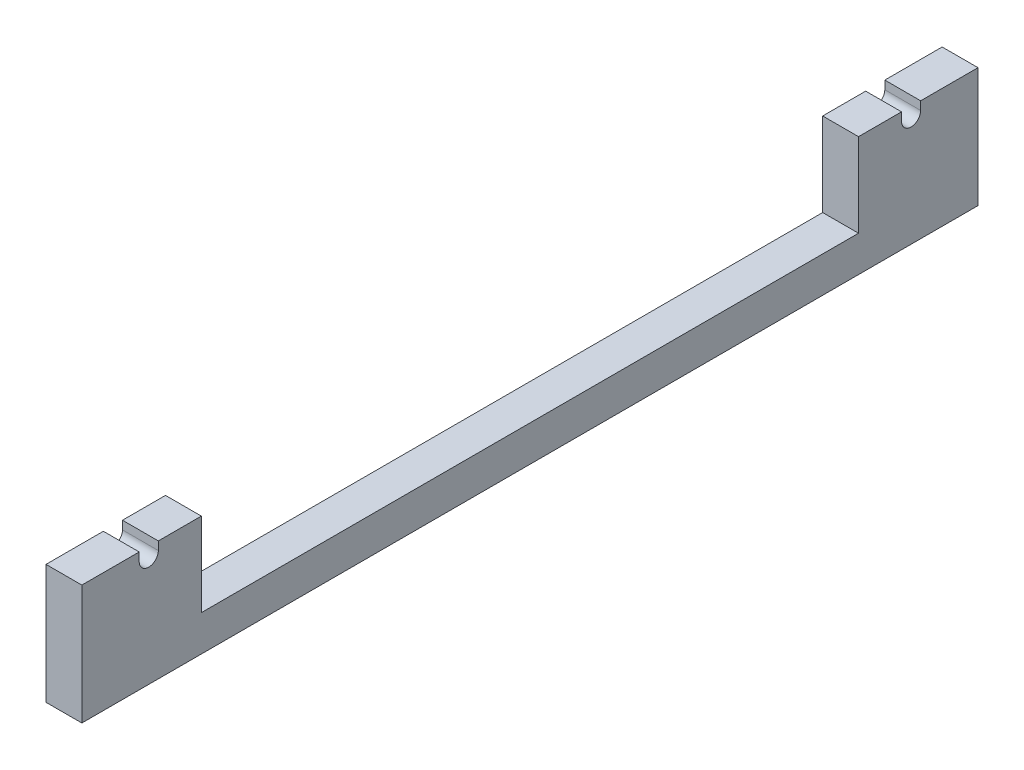
ISO-10303-21;
HEADER;
FILE_DESCRIPTION(('STEP AP214'),'2;1');
FILE_NAME('part.step','',(''),(''),'','','');
FILE_SCHEMA(('AUTOMOTIVE_DESIGN { 1 0 10303 214 1 1 1 1 }'));
ENDSEC;
DATA;
#1=APPLICATION_CONTEXT('core data for automotive mechanical design processes');
#2=APPLICATION_PROTOCOL_DEFINITION('international standard','automotive_design',2000,#1);
#3=PRODUCT_CONTEXT('',#1,'mechanical');
#4=PRODUCT('Part','Part','',(#3));
#5=PRODUCT_RELATED_PRODUCT_CATEGORY('part','',(#4));
#6=PRODUCT_DEFINITION_FORMATION('','',#4);
#7=PRODUCT_DEFINITION_CONTEXT('part definition',#1,'design');
#8=PRODUCT_DEFINITION('design','',#6,#7);
#9=PRODUCT_DEFINITION_SHAPE('','',#8);
#10=(LENGTH_UNIT() NAMED_UNIT(*) SI_UNIT(.MILLI.,.METRE.));
#11=(NAMED_UNIT(*) PLANE_ANGLE_UNIT() SI_UNIT($,.RADIAN.));
#12=(NAMED_UNIT(*) SI_UNIT($,.STERADIAN.) SOLID_ANGLE_UNIT());
#13=UNCERTAINTY_MEASURE_WITH_UNIT(LENGTH_MEASURE(1.E-05),#10,'distance_accuracy_value','');
#14=(GEOMETRIC_REPRESENTATION_CONTEXT(3) GLOBAL_UNCERTAINTY_ASSIGNED_CONTEXT((#13)) GLOBAL_UNIT_ASSIGNED_CONTEXT((#10,
#11,#12)) REPRESENTATION_CONTEXT('',''));
#15=CARTESIAN_POINT('',(0.,0.,0.));
#16=DIRECTION('',(0.,0.,1.));
#17=DIRECTION('',(1.,0.,0.));
#18=AXIS2_PLACEMENT_3D('',#15,#16,#17);
#19=CARTESIAN_POINT('',(15.,50.,0.));
#20=DIRECTION('',(0.,0.,-1.));
#21=DIRECTION('',(0.,1.,0.));
#22=AXIS2_PLACEMENT_3D('',#19,#20,#21);
#23=PLANE('',#22);
#24=DIRECTION('',(0.,-1.,0.));
#25=VECTOR('',#24,1.);
#26=CARTESIAN_POINT('',(0.,50.,0.));
#27=LINE('',#26,#25);
#28=CARTESIAN_POINT('',(0.,50.,0.));
#29=VERTEX_POINT('',#28);
#30=CARTESIAN_POINT('',(0.,0.,0.));
#31=VERTEX_POINT('',#30);
#32=EDGE_CURVE('E177',#29,#31,#27,.T.);
#33=ORIENTED_EDGE('',*,*,#32,.T.);
#34=DIRECTION('',(-1.,0.,0.));
#35=VECTOR('',#34,1.);
#36=CARTESIAN_POINT('',(15.,0.,0.));
#37=LINE('',#36,#35);
#38=CARTESIAN_POINT('',(15.,0.,0.));
#39=VERTEX_POINT('',#38);
#40=EDGE_CURVE('E11',#39,#31,#37,.T.);
#41=ORIENTED_EDGE('',*,*,#40,.F.);
#42=DIRECTION('',(0.,-1.,0.));
#43=VECTOR('',#42,1.);
#44=CARTESIAN_POINT('',(15.,50.,0.));
#45=LINE('',#44,#43);
#46=CARTESIAN_POINT('',(15.,50.,0.));
#47=VERTEX_POINT('',#46);
#48=EDGE_CURVE('E207',#47,#39,#45,.T.);
#49=ORIENTED_EDGE('',*,*,#48,.F.);
#50=DIRECTION('',(-1.,0.,0.));
#51=VECTOR('',#50,1.);
#52=CARTESIAN_POINT('',(15.,50.,0.));
#53=LINE('',#52,#51);
#54=EDGE_CURVE('E173',#47,#29,#53,.T.);
#55=ORIENTED_EDGE('',*,*,#54,.T.);
#56=EDGE_LOOP('',(#33,#41,#49,#55));
#57=FACE_BOUND('',#56,.T.);
#58=ADVANCED_FACE('F33',(#57),#23,.F.);
#59=CARTESIAN_POINT('',(15.,0.,0.));
#60=DIRECTION('',(0.,1.,0.));
#61=DIRECTION('',(0.,0.,1.));
#62=AXIS2_PLACEMENT_3D('',#59,#60,#61);
#63=PLANE('',#62);
#64=DIRECTION('',(0.,0.,-1.));
#65=VECTOR('',#64,1.);
#66=CARTESIAN_POINT('',(0.,0.,0.));
#67=LINE('',#66,#65);
#68=CARTESIAN_POINT('',(0.,0.,-375.));
#69=VERTEX_POINT('',#68);
#70=EDGE_CURVE('E180',#31,#69,#67,.T.);
#71=ORIENTED_EDGE('',*,*,#70,.T.);
#72=DIRECTION('',(-1.,0.,0.));
#73=VECTOR('',#72,1.);
#74=CARTESIAN_POINT('',(15.,0.,-375.));
#75=LINE('',#74,#73);
#76=CARTESIAN_POINT('',(15.,0.,-375.));
#77=VERTEX_POINT('',#76);
#78=EDGE_CURVE('E41',#77,#69,#75,.T.);
#79=ORIENTED_EDGE('',*,*,#78,.F.);
#80=DIRECTION('',(0.,0.,-1.));
#81=VECTOR('',#80,1.);
#82=CARTESIAN_POINT('',(15.,0.,0.));
#83=LINE('',#82,#81);
#84=EDGE_CURVE('E116',#39,#77,#83,.T.);
#85=ORIENTED_EDGE('',*,*,#84,.F.);
#86=ORIENTED_EDGE('',*,*,#40,.T.);
#87=EDGE_LOOP('',(#71,#79,#85,#86));
#88=FACE_BOUND('',#87,.T.);
#89=ADVANCED_FACE('F305',(#88),#63,.F.);
#90=CARTESIAN_POINT('',(15.,0.,-375.));
#91=DIRECTION('',(0.,0.,1.));
#92=DIRECTION('',(1.,0.,0.));
#93=AXIS2_PLACEMENT_3D('',#90,#91,#92);
#94=PLANE('',#93);
#95=DIRECTION('',(0.,1.,0.));
#96=VECTOR('',#95,1.);
#97=CARTESIAN_POINT('',(0.,0.,-375.));
#98=LINE('',#97,#96);
#99=CARTESIAN_POINT('',(0.,50.,-375.));
#100=VERTEX_POINT('',#99);
#101=EDGE_CURVE('E182',#69,#100,#98,.T.);
#102=ORIENTED_EDGE('',*,*,#101,.T.);
#103=DIRECTION('',(-1.,0.,0.));
#104=VECTOR('',#103,1.);
#105=CARTESIAN_POINT('',(15.,50.,-375.));
#106=LINE('',#105,#104);
#107=CARTESIAN_POINT('',(15.,50.,-375.));
#108=VERTEX_POINT('',#107);
#109=EDGE_CURVE('E238',#108,#100,#106,.T.);
#110=ORIENTED_EDGE('',*,*,#109,.F.);
#111=DIRECTION('',(0.,1.,0.));
#112=VECTOR('',#111,1.);
#113=CARTESIAN_POINT('',(15.,0.,-375.));
#114=LINE('',#113,#112);
#115=EDGE_CURVE('E246',#77,#108,#114,.T.);
#116=ORIENTED_EDGE('',*,*,#115,.F.);
#117=ORIENTED_EDGE('',*,*,#78,.T.);
#118=EDGE_LOOP('',(#102,#110,#116,#117));
#119=FACE_BOUND('',#118,.T.);
#120=ADVANCED_FACE('F244',(#119),#94,.F.);
#121=CARTESIAN_POINT('',(15.,50.,-375.));
#122=DIRECTION('',(0.,-1.,0.));
#123=DIRECTION('',(0.,0.,-1.));
#124=AXIS2_PLACEMENT_3D('',#121,#122,#123);
#125=PLANE('',#124);
#126=DIRECTION('',(0.,0.,1.));
#127=VECTOR('',#126,1.);
#128=CARTESIAN_POINT('',(0.,50.,-375.));
#129=LINE('',#128,#127);
#130=CARTESIAN_POINT('',(0.,50.,-351.));
#131=VERTEX_POINT('',#130);
#132=EDGE_CURVE('E184',#100,#131,#129,.T.);
#133=ORIENTED_EDGE('',*,*,#132,.T.);
#134=DIRECTION('',(-1.,0.,0.));
#135=VECTOR('',#134,1.);
#136=CARTESIAN_POINT('',(15.,50.,-351.));
#137=LINE('',#136,#135);
#138=CARTESIAN_POINT('',(15.,50.,-351.));
#139=VERTEX_POINT('',#138);
#140=EDGE_CURVE('E235',#139,#131,#137,.T.);
#141=ORIENTED_EDGE('',*,*,#140,.F.);
#142=DIRECTION('',(0.,0.,1.));
#143=VECTOR('',#142,1.);
#144=CARTESIAN_POINT('',(15.,50.,-375.));
#145=LINE('',#144,#143);
#146=EDGE_CURVE('E264',#108,#139,#145,.T.);
#147=ORIENTED_EDGE('',*,*,#146,.F.);
#148=ORIENTED_EDGE('',*,*,#109,.T.);
#149=EDGE_LOOP('',(#133,#141,#147,#148));
#150=FACE_BOUND('',#149,.T.);
#151=ADVANCED_FACE('F255',(#150),#125,.F.);
#152=CARTESIAN_POINT('',(15.,46.5,-351.));
#153=DIRECTION('',(0.,0.,-1.));
#154=DIRECTION('',(-1.,0.,0.));
#155=AXIS2_PLACEMENT_3D('',#152,#153,#154);
#156=PLANE('',#155);
#157=DIRECTION('',(0.,-1.,0.));
#158=VECTOR('',#157,1.);
#159=CARTESIAN_POINT('',(0.,46.5,-351.));
#160=LINE('',#159,#158);
#161=CARTESIAN_POINT('',(0.,46.5,-351.));
#162=VERTEX_POINT('',#161);
#163=EDGE_CURVE('E186',#131,#162,#160,.T.);
#164=ORIENTED_EDGE('',*,*,#163,.T.);
#165=DIRECTION('',(-1.,0.,0.));
#166=VECTOR('',#165,1.);
#167=CARTESIAN_POINT('',(15.,46.5,-351.));
#168=LINE('',#167,#166);
#169=CARTESIAN_POINT('',(15.,46.5,-351.));
#170=VERTEX_POINT('',#169);
#171=EDGE_CURVE('E232',#170,#162,#168,.T.);
#172=ORIENTED_EDGE('',*,*,#171,.F.);
#173=DIRECTION('',(0.,-1.,0.));
#174=VECTOR('',#173,1.);
#175=CARTESIAN_POINT('',(15.,46.5,-351.));
#176=LINE('',#175,#174);
#177=EDGE_CURVE('E261',#139,#170,#176,.T.);
#178=ORIENTED_EDGE('',*,*,#177,.F.);
#179=ORIENTED_EDGE('',*,*,#140,.T.);
#180=EDGE_LOOP('',(#164,#172,#178,#179));
#181=FACE_BOUND('',#180,.T.);
#182=ADVANCED_FACE('F259',(#181),#156,.F.);
#183=CARTESIAN_POINT('',(15.,46.5,-347.));
#184=DIRECTION('',(-1.,0.,0.));
#185=DIRECTION('',(0.,0.,1.));
#186=AXIS2_PLACEMENT_3D('',#183,#184,#185);
#187=CYLINDRICAL_SURFACE('',#186,4.);
#188=CARTESIAN_POINT('',(0.,46.5,-347.));
#189=DIRECTION('',(-1.,0.,0.));
#190=DIRECTION('',(0.,0.,-1.));
#191=AXIS2_PLACEMENT_3D('',#188,#189,#190);
#192=CIRCLE('',#191,4.);
#193=CARTESIAN_POINT('',(0.,46.5,-343.));
#194=VERTEX_POINT('',#193);
#195=EDGE_CURVE('E188',#162,#194,#192,.T.);
#196=ORIENTED_EDGE('',*,*,#195,.T.);
#197=DIRECTION('',(-1.,0.,0.));
#198=VECTOR('',#197,1.);
#199=CARTESIAN_POINT('',(15.,46.5,-343.));
#200=LINE('',#199,#198);
#201=CARTESIAN_POINT('',(15.,46.5,-343.));
#202=VERTEX_POINT('',#201);
#203=EDGE_CURVE('E229',#202,#194,#200,.T.);
#204=ORIENTED_EDGE('',*,*,#203,.F.);
#205=CARTESIAN_POINT('',(15.,46.5,-347.));
#206=DIRECTION('',(-1.,0.,0.));
#207=DIRECTION('',(0.,0.,-1.));
#208=AXIS2_PLACEMENT_3D('',#205,#206,#207);
#209=CIRCLE('',#208,4.);
#210=EDGE_CURVE('E263',#170,#202,#209,.T.);
#211=ORIENTED_EDGE('',*,*,#210,.F.);
#212=ORIENTED_EDGE('',*,*,#171,.T.);
#213=EDGE_LOOP('',(#196,#204,#211,#212));
#214=FACE_BOUND('',#213,.T.);
#215=ADVANCED_FACE('F318',(#214),#187,.F.);
#216=CARTESIAN_POINT('',(15.,46.5,-343.));
#217=DIRECTION('',(0.,0.,1.));
#218=DIRECTION('',(1.,0.,0.));
#219=AXIS2_PLACEMENT_3D('',#216,#217,#218);
#220=PLANE('',#219);
#221=DIRECTION('',(0.,1.,0.));
#222=VECTOR('',#221,1.);
#223=CARTESIAN_POINT('',(0.,46.5,-343.));
#224=LINE('',#223,#222);
#225=CARTESIAN_POINT('',(0.,50.,-343.));
#226=VERTEX_POINT('',#225);
#227=EDGE_CURVE('E190',#194,#226,#224,.T.);
#228=ORIENTED_EDGE('',*,*,#227,.T.);
#229=DIRECTION('',(-1.,0.,0.));
#230=VECTOR('',#229,1.);
#231=CARTESIAN_POINT('',(15.,50.,-343.));
#232=LINE('',#231,#230);
#233=CARTESIAN_POINT('',(15.,50.,-343.));
#234=VERTEX_POINT('',#233);
#235=EDGE_CURVE('E226',#234,#226,#232,.T.);
#236=ORIENTED_EDGE('',*,*,#235,.F.);
#237=DIRECTION('',(0.,1.,0.));
#238=VECTOR('',#237,1.);
#239=CARTESIAN_POINT('',(15.,46.5,-343.));
#240=LINE('',#239,#238);
#241=EDGE_CURVE('E266',#202,#234,#240,.T.);
#242=ORIENTED_EDGE('',*,*,#241,.F.);
#243=ORIENTED_EDGE('',*,*,#203,.T.);
#244=EDGE_LOOP('',(#228,#236,#242,#243));
#245=FACE_BOUND('',#244,.T.);
#246=ADVANCED_FACE('F321',(#245),#220,.F.);
#247=CARTESIAN_POINT('',(15.,50.,-343.));
#248=DIRECTION('',(0.,-1.,0.));
#249=DIRECTION('',(0.,0.,-1.));
#250=AXIS2_PLACEMENT_3D('',#247,#248,#249);
#251=PLANE('',#250);
#252=DIRECTION('',(0.,0.,1.));
#253=VECTOR('',#252,1.);
#254=CARTESIAN_POINT('',(0.,50.,-343.));
#255=LINE('',#254,#253);
#256=CARTESIAN_POINT('',(0.,50.,-325.));
#257=VERTEX_POINT('',#256);
#258=EDGE_CURVE('E192',#226,#257,#255,.T.);
#259=ORIENTED_EDGE('',*,*,#258,.T.);
#260=DIRECTION('',(-1.,0.,0.));
#261=VECTOR('',#260,1.);
#262=CARTESIAN_POINT('',(15.,50.,-325.));
#263=LINE('',#262,#261);
#264=CARTESIAN_POINT('',(15.,50.,-325.));
#265=VERTEX_POINT('',#264);
#266=EDGE_CURVE('E223',#265,#257,#263,.T.);
#267=ORIENTED_EDGE('',*,*,#266,.F.);
#268=DIRECTION('',(0.,0.,1.));
#269=VECTOR('',#268,1.);
#270=CARTESIAN_POINT('',(15.,50.,-343.));
#271=LINE('',#270,#269);
#272=EDGE_CURVE('E272',#234,#265,#271,.T.);
#273=ORIENTED_EDGE('',*,*,#272,.F.);
#274=ORIENTED_EDGE('',*,*,#235,.T.);
#275=EDGE_LOOP('',(#259,#267,#273,#274));
#276=FACE_BOUND('',#275,.T.);
#277=ADVANCED_FACE('F325',(#276),#251,.F.);
#278=CARTESIAN_POINT('',(15.,50.,-325.));
#279=DIRECTION('',(0.,0.,-1.));
#280=DIRECTION('',(-1.,0.,0.));
#281=AXIS2_PLACEMENT_3D('',#278,#279,#280);
#282=PLANE('',#281);
#283=DIRECTION('',(0.,-1.,0.));
#284=VECTOR('',#283,1.);
#285=CARTESIAN_POINT('',(0.,50.,-325.));
#286=LINE('',#285,#284);
#287=CARTESIAN_POINT('',(0.,15.,-325.));
#288=VERTEX_POINT('',#287);
#289=EDGE_CURVE('E194',#257,#288,#286,.T.);
#290=ORIENTED_EDGE('',*,*,#289,.T.);
#291=DIRECTION('',(-1.,0.,0.));
#292=VECTOR('',#291,1.);
#293=CARTESIAN_POINT('',(15.,15.,-325.));
#294=LINE('',#293,#292);
#295=CARTESIAN_POINT('',(15.,15.,-325.));
#296=VERTEX_POINT('',#295);
#297=EDGE_CURVE('E220',#296,#288,#294,.T.);
#298=ORIENTED_EDGE('',*,*,#297,.F.);
#299=DIRECTION('',(0.,-1.,0.));
#300=VECTOR('',#299,1.);
#301=CARTESIAN_POINT('',(15.,50.,-325.));
#302=LINE('',#301,#300);
#303=EDGE_CURVE('E274',#265,#296,#302,.T.);
#304=ORIENTED_EDGE('',*,*,#303,.F.);
#305=ORIENTED_EDGE('',*,*,#266,.T.);
#306=EDGE_LOOP('',(#290,#298,#304,#305));
#307=FACE_BOUND('',#306,.T.);
#308=ADVANCED_FACE('F329',(#307),#282,.F.);
#309=CARTESIAN_POINT('',(15.,15.,-325.));
#310=DIRECTION('',(0.,-1.,0.));
#311=DIRECTION('',(0.,0.,-1.));
#312=AXIS2_PLACEMENT_3D('',#309,#310,#311);
#313=PLANE('',#312);
#314=DIRECTION('',(0.,0.,1.));
#315=VECTOR('',#314,1.);
#316=CARTESIAN_POINT('',(0.,15.,-325.));
#317=LINE('',#316,#315);
#318=CARTESIAN_POINT('',(0.,15.,-50.));
#319=VERTEX_POINT('',#318);
#320=EDGE_CURVE('E196',#288,#319,#317,.T.);
#321=ORIENTED_EDGE('',*,*,#320,.T.);
#322=DIRECTION('',(-1.,0.,0.));
#323=VECTOR('',#322,1.);
#324=CARTESIAN_POINT('',(15.,15.,-50.));
#325=LINE('',#324,#323);
#326=CARTESIAN_POINT('',(15.,15.,-50.));
#327=VERTEX_POINT('',#326);
#328=EDGE_CURVE('E217',#327,#319,#325,.T.);
#329=ORIENTED_EDGE('',*,*,#328,.F.);
#330=DIRECTION('',(0.,0.,1.));
#331=VECTOR('',#330,1.);
#332=CARTESIAN_POINT('',(15.,15.,-325.));
#333=LINE('',#332,#331);
#334=EDGE_CURVE('E276',#296,#327,#333,.T.);
#335=ORIENTED_EDGE('',*,*,#334,.F.);
#336=ORIENTED_EDGE('',*,*,#297,.T.);
#337=EDGE_LOOP('',(#321,#329,#335,#336));
#338=FACE_BOUND('',#337,.T.);
#339=ADVANCED_FACE('F333',(#338),#313,.F.);
#340=CARTESIAN_POINT('',(15.,15.,-50.));
#341=DIRECTION('',(0.,0.,1.));
#342=DIRECTION('',(1.,0.,0.));
#343=AXIS2_PLACEMENT_3D('',#340,#341,#342);
#344=PLANE('',#343);
#345=DIRECTION('',(0.,1.,0.));
#346=VECTOR('',#345,1.);
#347=CARTESIAN_POINT('',(0.,15.,-50.));
#348=LINE('',#347,#346);
#349=CARTESIAN_POINT('',(0.,50.,-50.));
#350=VERTEX_POINT('',#349);
#351=EDGE_CURVE('E198',#319,#350,#348,.T.);
#352=ORIENTED_EDGE('',*,*,#351,.T.);
#353=DIRECTION('',(-1.,0.,0.));
#354=VECTOR('',#353,1.);
#355=CARTESIAN_POINT('',(15.,50.,-50.));
#356=LINE('',#355,#354);
#357=CARTESIAN_POINT('',(15.,50.,-50.));
#358=VERTEX_POINT('',#357);
#359=EDGE_CURVE('E214',#358,#350,#356,.T.);
#360=ORIENTED_EDGE('',*,*,#359,.F.);
#361=DIRECTION('',(0.,1.,0.));
#362=VECTOR('',#361,1.);
#363=CARTESIAN_POINT('',(15.,15.,-50.));
#364=LINE('',#363,#362);
#365=EDGE_CURVE('E278',#327,#358,#364,.T.);
#366=ORIENTED_EDGE('',*,*,#365,.F.);
#367=ORIENTED_EDGE('',*,*,#328,.T.);
#368=EDGE_LOOP('',(#352,#360,#366,#367));
#369=FACE_BOUND('',#368,.T.);
#370=ADVANCED_FACE('F337',(#369),#344,.F.);
#371=CARTESIAN_POINT('',(15.,50.,-50.));
#372=DIRECTION('',(0.,-1.,0.));
#373=DIRECTION('',(0.,0.,-1.));
#374=AXIS2_PLACEMENT_3D('',#371,#372,#373);
#375=PLANE('',#374);
#376=DIRECTION('',(0.,0.,1.));
#377=VECTOR('',#376,1.);
#378=CARTESIAN_POINT('',(0.,50.,-50.));
#379=LINE('',#378,#377);
#380=CARTESIAN_POINT('',(0.,50.,-32.));
#381=VERTEX_POINT('',#380);
#382=EDGE_CURVE('E200',#350,#381,#379,.T.);
#383=ORIENTED_EDGE('',*,*,#382,.T.);
#384=DIRECTION('',(-1.,0.,0.));
#385=VECTOR('',#384,1.);
#386=CARTESIAN_POINT('',(15.,50.,-32.));
#387=LINE('',#386,#385);
#388=CARTESIAN_POINT('',(15.,50.,-32.));
#389=VERTEX_POINT('',#388);
#390=EDGE_CURVE('E211',#389,#381,#387,.T.);
#391=ORIENTED_EDGE('',*,*,#390,.F.);
#392=DIRECTION('',(0.,0.,1.));
#393=VECTOR('',#392,1.);
#394=CARTESIAN_POINT('',(15.,50.,-50.));
#395=LINE('',#394,#393);
#396=EDGE_CURVE('E280',#358,#389,#395,.T.);
#397=ORIENTED_EDGE('',*,*,#396,.F.);
#398=ORIENTED_EDGE('',*,*,#359,.T.);
#399=EDGE_LOOP('',(#383,#391,#397,#398));
#400=FACE_BOUND('',#399,.T.);
#401=ADVANCED_FACE('F286',(#400),#375,.F.);
#402=CARTESIAN_POINT('',(15.,46.5,-32.));
#403=DIRECTION('',(0.,0.,-1.));
#404=DIRECTION('',(-1.,0.,0.));
#405=AXIS2_PLACEMENT_3D('',#402,#403,#404);
#406=PLANE('',#405);
#407=DIRECTION('',(0.,-1.,0.));
#408=VECTOR('',#407,1.);
#409=CARTESIAN_POINT('',(0.,46.5,-32.));
#410=LINE('',#409,#408);
#411=CARTESIAN_POINT('',(0.,46.5,-32.));
#412=VERTEX_POINT('',#411);
#413=EDGE_CURVE('E202',#381,#412,#410,.T.);
#414=ORIENTED_EDGE('',*,*,#413,.T.);
#415=DIRECTION('',(-1.,0.,0.));
#416=VECTOR('',#415,1.);
#417=CARTESIAN_POINT('',(15.,46.5,-32.));
#418=LINE('',#417,#416);
#419=CARTESIAN_POINT('',(15.,46.5,-32.));
#420=VERTEX_POINT('',#419);
#421=EDGE_CURVE('E168',#420,#412,#418,.T.);
#422=ORIENTED_EDGE('',*,*,#421,.F.);
#423=DIRECTION('',(0.,-1.,0.));
#424=VECTOR('',#423,1.);
#425=CARTESIAN_POINT('',(15.,46.5,-32.));
#426=LINE('',#425,#424);
#427=EDGE_CURVE('E159',#389,#420,#426,.T.);
#428=ORIENTED_EDGE('',*,*,#427,.F.);
#429=ORIENTED_EDGE('',*,*,#390,.T.);
#430=EDGE_LOOP('',(#414,#422,#428,#429));
#431=FACE_BOUND('',#430,.T.);
#432=ADVANCED_FACE('F290',(#431),#406,.F.);
#433=CARTESIAN_POINT('',(15.,46.5,-28.));
#434=DIRECTION('',(-1.,0.,0.));
#435=DIRECTION('',(0.,0.,1.));
#436=AXIS2_PLACEMENT_3D('',#433,#434,#435);
#437=CYLINDRICAL_SURFACE('',#436,4.);
#438=CARTESIAN_POINT('',(0.,46.5,-28.));
#439=DIRECTION('',(-1.,0.,0.));
#440=DIRECTION('',(0.,0.,-1.));
#441=AXIS2_PLACEMENT_3D('',#438,#439,#440);
#442=CIRCLE('',#441,4.);
#443=CARTESIAN_POINT('',(0.,46.5,-24.));
#444=VERTEX_POINT('',#443);
#445=EDGE_CURVE('E167',#412,#444,#442,.T.);
#446=ORIENTED_EDGE('',*,*,#445,.T.);
#447=DIRECTION('',(-1.,0.,0.));
#448=VECTOR('',#447,1.);
#449=CARTESIAN_POINT('',(15.,46.5,-24.));
#450=LINE('',#449,#448);
#451=CARTESIAN_POINT('',(15.,46.5,-24.));
#452=VERTEX_POINT('',#451);
#453=EDGE_CURVE('E164',#452,#444,#450,.T.);
#454=ORIENTED_EDGE('',*,*,#453,.F.);
#455=CARTESIAN_POINT('',(15.,46.5,-28.));
#456=DIRECTION('',(-1.,0.,0.));
#457=DIRECTION('',(0.,0.,-1.));
#458=AXIS2_PLACEMENT_3D('',#455,#456,#457);
#459=CIRCLE('',#458,4.);
#460=EDGE_CURVE('E153',#420,#452,#459,.T.);
#461=ORIENTED_EDGE('',*,*,#460,.F.);
#462=ORIENTED_EDGE('',*,*,#421,.T.);
#463=EDGE_LOOP('',(#446,#454,#461,#462));
#464=FACE_BOUND('',#463,.T.);
#465=ADVANCED_FACE('F165',(#464),#437,.F.);
#466=CARTESIAN_POINT('',(15.,46.5,-24.));
#467=DIRECTION('',(0.,0.,1.));
#468=DIRECTION('',(1.,0.,0.));
#469=AXIS2_PLACEMENT_3D('',#466,#467,#468);
#470=PLANE('',#469);
#471=DIRECTION('',(0.,1.,0.));
#472=VECTOR('',#471,1.);
#473=CARTESIAN_POINT('',(0.,46.5,-24.));
#474=LINE('',#473,#472);
#475=CARTESIAN_POINT('',(0.,50.,-24.));
#476=VERTEX_POINT('',#475);
#477=EDGE_CURVE('E102',#444,#476,#474,.T.);
#478=ORIENTED_EDGE('',*,*,#477,.T.);
#479=DIRECTION('',(-1.,0.,0.));
#480=VECTOR('',#479,1.);
#481=CARTESIAN_POINT('',(15.,50.,-24.));
#482=LINE('',#481,#480);
#483=CARTESIAN_POINT('',(15.,50.,-24.));
#484=VERTEX_POINT('',#483);
#485=EDGE_CURVE('E169',#484,#476,#482,.T.);
#486=ORIENTED_EDGE('',*,*,#485,.F.);
#487=DIRECTION('',(0.,1.,0.));
#488=VECTOR('',#487,1.);
#489=CARTESIAN_POINT('',(15.,46.5,-24.));
#490=LINE('',#489,#488);
#491=EDGE_CURVE('E157',#452,#484,#490,.T.);
#492=ORIENTED_EDGE('',*,*,#491,.F.);
#493=ORIENTED_EDGE('',*,*,#453,.T.);
#494=EDGE_LOOP('',(#478,#486,#492,#493));
#495=FACE_BOUND('',#494,.T.);
#496=ADVANCED_FACE('F171',(#495),#470,.F.);
#497=CARTESIAN_POINT('',(15.,50.,-24.));
#498=DIRECTION('',(0.,-1.,0.));
#499=DIRECTION('',(0.,0.,-1.));
#500=AXIS2_PLACEMENT_3D('',#497,#498,#499);
#501=PLANE('',#500);
#502=DIRECTION('',(0.,0.,1.));
#503=VECTOR('',#502,1.);
#504=CARTESIAN_POINT('',(0.,50.,-24.));
#505=LINE('',#504,#503);
#506=EDGE_CURVE('E108',#476,#29,#505,.T.);
#507=ORIENTED_EDGE('',*,*,#506,.T.);
#508=ORIENTED_EDGE('',*,*,#54,.F.);
#509=DIRECTION('',(0.,0.,1.));
#510=VECTOR('',#509,1.);
#511=CARTESIAN_POINT('',(15.,50.,-24.));
#512=LINE('',#511,#510);
#513=EDGE_CURVE('E49',#484,#47,#512,.T.);
#514=ORIENTED_EDGE('',*,*,#513,.F.);
#515=ORIENTED_EDGE('',*,*,#485,.T.);
#516=EDGE_LOOP('',(#507,#508,#514,#515));
#517=FACE_BOUND('',#516,.T.);
#518=ADVANCED_FACE('F294',(#517),#501,.F.);
#519=CARTESIAN_POINT('',(15.,46.5,-347.));
#520=DIRECTION('',(1.,0.,0.));
#521=DIRECTION('',(0.,0.,-1.));
#522=AXIS2_PLACEMENT_3D('',#519,#520,#521);
#523=PLANE('',#522);
#524=ORIENTED_EDGE('',*,*,#48,.T.);
#525=ORIENTED_EDGE('',*,*,#84,.T.);
#526=ORIENTED_EDGE('',*,*,#115,.T.);
#527=ORIENTED_EDGE('',*,*,#146,.T.);
#528=ORIENTED_EDGE('',*,*,#177,.T.);
#529=ORIENTED_EDGE('',*,*,#210,.T.);
#530=ORIENTED_EDGE('',*,*,#241,.T.);
#531=ORIENTED_EDGE('',*,*,#272,.T.);
#532=ORIENTED_EDGE('',*,*,#303,.T.);
#533=ORIENTED_EDGE('',*,*,#334,.T.);
#534=ORIENTED_EDGE('',*,*,#365,.T.);
#535=ORIENTED_EDGE('',*,*,#396,.T.);
#536=ORIENTED_EDGE('',*,*,#427,.T.);
#537=ORIENTED_EDGE('',*,*,#460,.T.);
#538=ORIENTED_EDGE('',*,*,#491,.T.);
#539=ORIENTED_EDGE('',*,*,#513,.T.);
#540=EDGE_LOOP('',(#524,#525,#526,#527,#528,#529,#530,#531,#532,#533,#534,#535,#536,#537,#538,#539));
#541=FACE_BOUND('',#540,.T.);
#542=ADVANCED_FACE('F155',(#541),#523,.T.);
#543=CARTESIAN_POINT('',(0.,46.5,-347.));
#544=DIRECTION('',(1.,0.,0.));
#545=DIRECTION('',(0.,0.,-1.));
#546=AXIS2_PLACEMENT_3D('',#543,#544,#545);
#547=PLANE('',#546);
#548=ORIENTED_EDGE('',*,*,#32,.F.);
#549=ORIENTED_EDGE('',*,*,#506,.F.);
#550=ORIENTED_EDGE('',*,*,#477,.F.);
#551=ORIENTED_EDGE('',*,*,#445,.F.);
#552=ORIENTED_EDGE('',*,*,#413,.F.);
#553=ORIENTED_EDGE('',*,*,#382,.F.);
#554=ORIENTED_EDGE('',*,*,#351,.F.);
#555=ORIENTED_EDGE('',*,*,#320,.F.);
#556=ORIENTED_EDGE('',*,*,#289,.F.);
#557=ORIENTED_EDGE('',*,*,#258,.F.);
#558=ORIENTED_EDGE('',*,*,#227,.F.);
#559=ORIENTED_EDGE('',*,*,#195,.F.);
#560=ORIENTED_EDGE('',*,*,#163,.F.);
#561=ORIENTED_EDGE('',*,*,#132,.F.);
#562=ORIENTED_EDGE('',*,*,#101,.F.);
#563=ORIENTED_EDGE('',*,*,#70,.F.);
#564=EDGE_LOOP('',(#548,#549,#550,#551,#552,#553,#554,#555,#556,#557,#558,#559,#560,#561,#562,#563));
#565=FACE_BOUND('',#564,.T.);
#566=ADVANCED_FACE('F250',(#565),#547,.F.);
#567=CLOSED_SHELL('',(#58,#89,#120,#151,#182,#215,#246,#277,#308,#339,#370,#401,#432,#465,#496,
#518,#542,#566));
#568=MANIFOLD_SOLID_BREP('B2',#567);
#569=ADVANCED_BREP_SHAPE_REPRESENTATION('',(#18,#568),#14);
#570=SHAPE_DEFINITION_REPRESENTATION(#9,#569);
ENDSEC;
END-ISO-10303-21;
